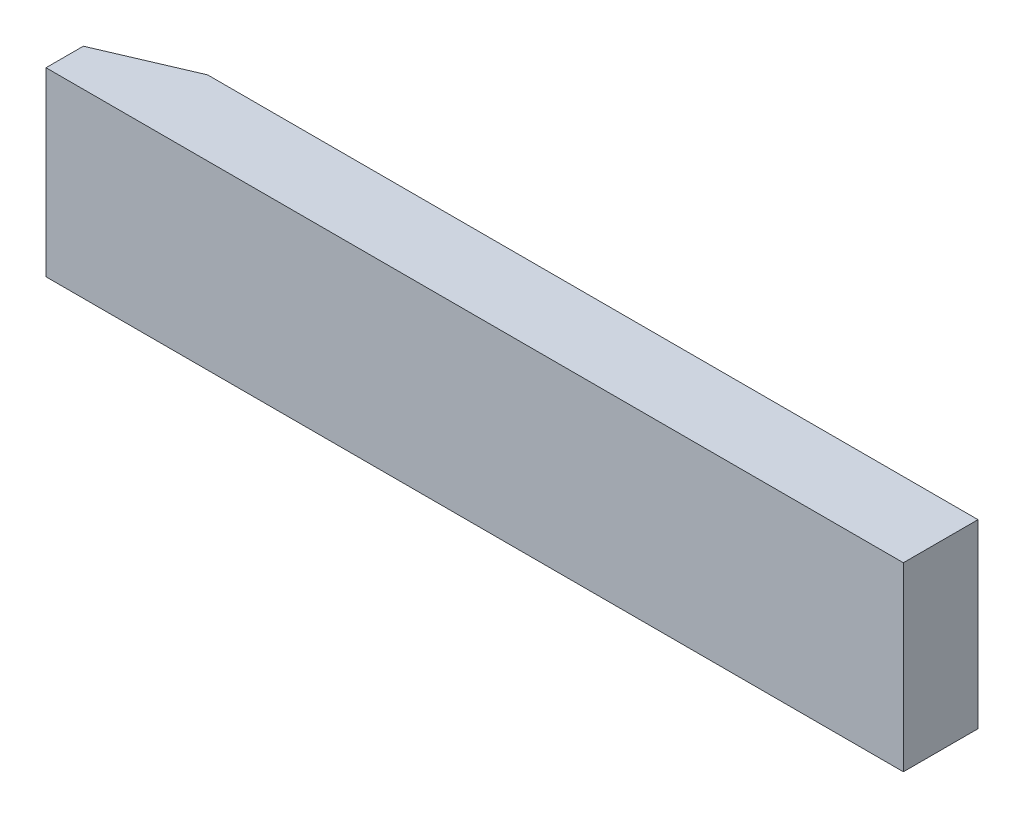
ISO-10303-21;
HEADER;
FILE_DESCRIPTION(('STEP AP214'),'2;1');
FILE_NAME('part.step','',(''),(''),'','','');
FILE_SCHEMA(('AUTOMOTIVE_DESIGN { 1 0 10303 214 1 1 1 1 }'));
ENDSEC;
DATA;
#1=APPLICATION_CONTEXT('core data for automotive mechanical design processes');
#2=APPLICATION_PROTOCOL_DEFINITION('international standard','automotive_design',2000,#1);
#3=PRODUCT_CONTEXT('',#1,'mechanical');
#4=PRODUCT('Part','Part','',(#3));
#5=PRODUCT_RELATED_PRODUCT_CATEGORY('part','',(#4));
#6=PRODUCT_DEFINITION_FORMATION('','',#4);
#7=PRODUCT_DEFINITION_CONTEXT('part definition',#1,'design');
#8=PRODUCT_DEFINITION('design','',#6,#7);
#9=PRODUCT_DEFINITION_SHAPE('','',#8);
#10=(LENGTH_UNIT() NAMED_UNIT(*) SI_UNIT(.MILLI.,.METRE.));
#11=(NAMED_UNIT(*) PLANE_ANGLE_UNIT() SI_UNIT($,.RADIAN.));
#12=(NAMED_UNIT(*) SI_UNIT($,.STERADIAN.) SOLID_ANGLE_UNIT());
#13=UNCERTAINTY_MEASURE_WITH_UNIT(LENGTH_MEASURE(1.E-05),#10,'distance_accuracy_value','');
#14=(GEOMETRIC_REPRESENTATION_CONTEXT(3) GLOBAL_UNCERTAINTY_ASSIGNED_CONTEXT((#13)) GLOBAL_UNIT_ASSIGNED_CONTEXT((#10,
#11,#12)) REPRESENTATION_CONTEXT('',''));
#15=CARTESIAN_POINT('',(0.,0.,0.));
#16=DIRECTION('',(0.,0.,1.));
#17=DIRECTION('',(1.,0.,0.));
#18=AXIS2_PLACEMENT_3D('',#15,#16,#17);
#19=CARTESIAN_POINT('',(0.,25.4,0.));
#20=DIRECTION('',(1.,0.,0.));
#21=DIRECTION('',(0.,0.,-1.));
#22=AXIS2_PLACEMENT_3D('',#19,#20,#21);
#23=PLANE('',#22);
#24=DIRECTION('',(0.,0.,1.));
#25=VECTOR('',#24,1.);
#26=CARTESIAN_POINT('',(0.,25.4,0.));
#27=LINE('',#26,#25);
#28=CARTESIAN_POINT('',(0.,25.4,-5.23314889229932));
#29=VERTEX_POINT('',#28);
#30=CARTESIAN_POINT('',(0.,25.4,0.));
#31=VERTEX_POINT('',#30);
#32=EDGE_CURVE('E84',#29,#31,#27,.T.);
#33=ORIENTED_EDGE('',*,*,#32,.F.);
#34=DIRECTION('',(0.,1.,0.));
#35=VECTOR('',#34,1.);
#36=CARTESIAN_POINT('',(0.,0.,-5.23314889229932));
#37=LINE('',#36,#35);
#38=CARTESIAN_POINT('',(0.,0.,-5.23314889229932));
#39=VERTEX_POINT('',#38);
#40=EDGE_CURVE('E95',#39,#29,#37,.T.);
#41=ORIENTED_EDGE('',*,*,#40,.F.);
#42=DIRECTION('',(0.,0.,1.));
#43=VECTOR('',#42,1.);
#44=CARTESIAN_POINT('',(0.,0.,0.));
#45=LINE('',#44,#43);
#46=CARTESIAN_POINT('',(0.,0.,0.));
#47=VERTEX_POINT('',#46);
#48=EDGE_CURVE('E104',#39,#47,#45,.T.);
#49=ORIENTED_EDGE('',*,*,#48,.T.);
#50=DIRECTION('',(0.,-1.,0.));
#51=VECTOR('',#50,1.);
#52=CARTESIAN_POINT('',(0.,25.4,0.));
#53=LINE('',#52,#51);
#54=EDGE_CURVE('E11',#31,#47,#53,.T.);
#55=ORIENTED_EDGE('',*,*,#54,.F.);
#56=EDGE_LOOP('',(#33,#41,#49,#55));
#57=FACE_BOUND('',#56,.T.);
#58=ADVANCED_FACE('F39',(#57),#23,.F.);
#59=CARTESIAN_POINT('',(0.,25.4,0.));
#60=DIRECTION('',(0.,0.,-1.));
#61=DIRECTION('',(-1.,0.,0.));
#62=AXIS2_PLACEMENT_3D('',#59,#60,#61);
#63=PLANE('',#62);
#64=DIRECTION('',(1.,0.,0.));
#65=VECTOR('',#64,1.);
#66=CARTESIAN_POINT('',(0.,0.,0.));
#67=LINE('',#66,#65);
#68=CARTESIAN_POINT('',(120.25981376029,0.,0.));
#69=VERTEX_POINT('',#68);
#70=EDGE_CURVE('E108',#47,#69,#67,.T.);
#71=ORIENTED_EDGE('',*,*,#70,.T.);
#72=DIRECTION('',(0.,-1.,0.));
#73=VECTOR('',#72,1.);
#74=CARTESIAN_POINT('',(120.25981376029,25.4,0.));
#75=LINE('',#74,#73);
#76=CARTESIAN_POINT('',(120.25981376029,25.4,0.));
#77=VERTEX_POINT('',#76);
#78=EDGE_CURVE('E46',#77,#69,#75,.T.);
#79=ORIENTED_EDGE('',*,*,#78,.F.);
#80=DIRECTION('',(1.,0.,0.));
#81=VECTOR('',#80,1.);
#82=CARTESIAN_POINT('',(0.,25.4,0.));
#83=LINE('',#82,#81);
#84=EDGE_CURVE('E126',#31,#77,#83,.T.);
#85=ORIENTED_EDGE('',*,*,#84,.F.);
#86=ORIENTED_EDGE('',*,*,#54,.T.);
#87=EDGE_LOOP('',(#71,#79,#85,#86));
#88=FACE_BOUND('',#87,.T.);
#89=ADVANCED_FACE('F141',(#88),#63,.F.);
#90=CARTESIAN_POINT('',(120.25981376029,25.4,0.));
#91=DIRECTION('',(-1.,0.,0.));
#92=DIRECTION('',(0.,0.,1.));
#93=AXIS2_PLACEMENT_3D('',#90,#91,#92);
#94=PLANE('',#93);
#95=DIRECTION('',(0.,0.,-1.));
#96=VECTOR('',#95,1.);
#97=CARTESIAN_POINT('',(120.25981376029,0.,0.));
#98=LINE('',#97,#96);
#99=CARTESIAN_POINT('',(120.25981376029,0.,-10.4662977845986));
#100=VERTEX_POINT('',#99);
#101=EDGE_CURVE('E79',#69,#100,#98,.T.);
#102=ORIENTED_EDGE('',*,*,#101,.T.);
#103=DIRECTION('',(0.,-1.,0.));
#104=VECTOR('',#103,1.);
#105=CARTESIAN_POINT('',(120.25981376029,25.4,-10.4662977845986));
#106=LINE('',#105,#104);
#107=CARTESIAN_POINT('',(120.25981376029,25.4,-10.4662977845986));
#108=VERTEX_POINT('',#107);
#109=EDGE_CURVE('E119',#108,#100,#106,.T.);
#110=ORIENTED_EDGE('',*,*,#109,.F.);
#111=DIRECTION('',(0.,0.,-1.));
#112=VECTOR('',#111,1.);
#113=CARTESIAN_POINT('',(120.25981376029,25.4,0.));
#114=LINE('',#113,#112);
#115=EDGE_CURVE('E62',#77,#108,#114,.T.);
#116=ORIENTED_EDGE('',*,*,#115,.F.);
#117=ORIENTED_EDGE('',*,*,#78,.T.);
#118=EDGE_LOOP('',(#102,#110,#116,#117));
#119=FACE_BOUND('',#118,.T.);
#120=ADVANCED_FACE('F121',(#119),#94,.F.);
#121=CARTESIAN_POINT('',(0.,25.4,-10.4662977845986));
#122=DIRECTION('',(0.,0.,1.));
#123=DIRECTION('',(1.,0.,0.));
#124=AXIS2_PLACEMENT_3D('',#121,#122,#123);
#125=PLANE('',#124);
#126=DIRECTION('',(-1.,0.,0.));
#127=VECTOR('',#126,1.);
#128=CARTESIAN_POINT('',(0.,0.,-10.4662977845986));
#129=LINE('',#128,#127);
#130=CARTESIAN_POINT('',(12.1974448291845,0.,-10.4662977845986));
#131=VERTEX_POINT('',#130);
#132=EDGE_CURVE('E117',#100,#131,#129,.T.);
#133=ORIENTED_EDGE('',*,*,#132,.T.);
#134=DIRECTION('',(0.,1.,0.));
#135=VECTOR('',#134,1.);
#136=CARTESIAN_POINT('',(12.1974448291845,0.,-10.4662977845986));
#137=LINE('',#136,#135);
#138=CARTESIAN_POINT('',(12.1974448291845,25.4,-10.4662977845986));
#139=VERTEX_POINT('',#138);
#140=EDGE_CURVE('E53',#131,#139,#137,.T.);
#141=ORIENTED_EDGE('',*,*,#140,.T.);
#142=DIRECTION('',(-1.,0.,0.));
#143=VECTOR('',#142,1.);
#144=CARTESIAN_POINT('',(0.,25.4,-10.4662977845986));
#145=LINE('',#144,#143);
#146=EDGE_CURVE('E113',#108,#139,#145,.T.);
#147=ORIENTED_EDGE('',*,*,#146,.F.);
#148=ORIENTED_EDGE('',*,*,#109,.T.);
#149=EDGE_LOOP('',(#133,#141,#147,#148));
#150=FACE_BOUND('',#149,.T.);
#151=ADVANCED_FACE('F124',(#150),#125,.F.);
#152=CARTESIAN_POINT('',(0.,25.4,0.));
#153=DIRECTION('',(0.,-1.,0.));
#154=DIRECTION('',(0.,0.,-1.));
#155=AXIS2_PLACEMENT_3D('',#152,#153,#154);
#156=PLANE('',#155);
#157=ORIENTED_EDGE('',*,*,#146,.T.);
#158=DIRECTION('',(0.918990216225255,0.,-0.394280334891635));
#159=VECTOR('',#158,1.);
#160=CARTESIAN_POINT('',(0.,25.4,-5.23314889229932));
#161=LINE('',#160,#159);
#162=EDGE_CURVE('E100',#29,#139,#161,.T.);
#163=ORIENTED_EDGE('',*,*,#162,.F.);
#164=ORIENTED_EDGE('',*,*,#32,.T.);
#165=ORIENTED_EDGE('',*,*,#84,.T.);
#166=ORIENTED_EDGE('',*,*,#115,.T.);
#167=EDGE_LOOP('',(#157,#163,#164,#165,#166));
#168=FACE_BOUND('',#167,.T.);
#169=ADVANCED_FACE('F130',(#168),#156,.F.);
#170=CARTESIAN_POINT('',(0.,0.,0.));
#171=DIRECTION('',(0.,-1.,0.));
#172=DIRECTION('',(0.,0.,-1.));
#173=AXIS2_PLACEMENT_3D('',#170,#171,#172);
#174=PLANE('',#173);
#175=DIRECTION('',(0.918990216225255,0.,-0.394280334891635));
#176=VECTOR('',#175,1.);
#177=CARTESIAN_POINT('',(0.,0.,-5.23314889229932));
#178=LINE('',#177,#176);
#179=EDGE_CURVE('E92',#39,#131,#178,.T.);
#180=ORIENTED_EDGE('',*,*,#179,.T.);
#181=ORIENTED_EDGE('',*,*,#132,.F.);
#182=ORIENTED_EDGE('',*,*,#101,.F.);
#183=ORIENTED_EDGE('',*,*,#70,.F.);
#184=ORIENTED_EDGE('',*,*,#48,.F.);
#185=EDGE_LOOP('',(#180,#181,#182,#183,#184));
#186=FACE_BOUND('',#185,.T.);
#187=ADVANCED_FACE('F107',(#186),#174,.T.);
#188=CARTESIAN_POINT('',(0.,0.,-5.23314889229932));
#189=DIRECTION('',(0.394280334891635,0.,0.918990216225255));
#190=DIRECTION('',(0.918990216225255,0.,-0.394280334891635));
#191=AXIS2_PLACEMENT_3D('',#188,#189,#190);
#192=PLANE('',#191);
#193=ORIENTED_EDGE('',*,*,#162,.T.);
#194=ORIENTED_EDGE('',*,*,#140,.F.);
#195=ORIENTED_EDGE('',*,*,#179,.F.);
#196=ORIENTED_EDGE('',*,*,#40,.T.);
#197=EDGE_LOOP('',(#193,#194,#195,#196));
#198=FACE_BOUND('',#197,.T.);
#199=ADVANCED_FACE('F94',(#198),#192,.F.);
#200=CLOSED_SHELL('',(#58,#89,#120,#151,#169,#187,#199));
#201=MANIFOLD_SOLID_BREP('B2',#200);
#202=ADVANCED_BREP_SHAPE_REPRESENTATION('',(#18,#201),#14);
#203=SHAPE_DEFINITION_REPRESENTATION(#9,#202);
ENDSEC;
END-ISO-10303-21;
